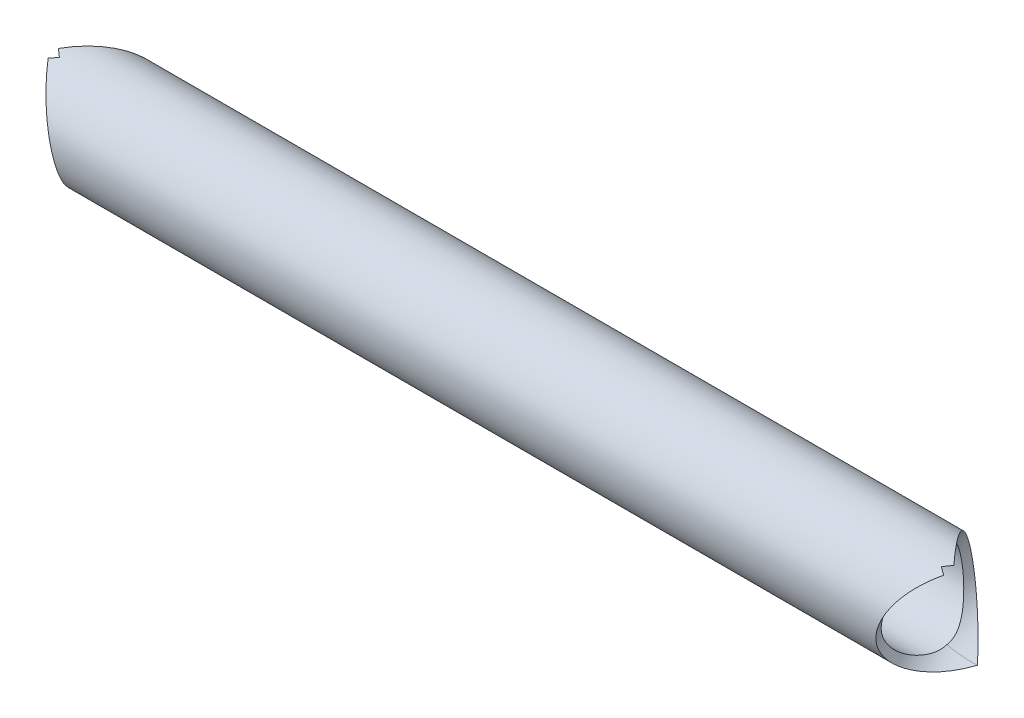
ISO-10303-21;
HEADER;
FILE_DESCRIPTION(('STEP AP214'),'2;1');
FILE_NAME('part.step','',(''),(''),'','','');
FILE_SCHEMA(('AUTOMOTIVE_DESIGN { 1 0 10303 214 1 1 1 1 }'));
ENDSEC;
DATA;
#1=APPLICATION_CONTEXT('core data for automotive mechanical design processes');
#2=APPLICATION_PROTOCOL_DEFINITION('international standard','automotive_design',2000,#1);
#3=PRODUCT_CONTEXT('',#1,'mechanical');
#4=PRODUCT('Part','Part','',(#3));
#5=PRODUCT_RELATED_PRODUCT_CATEGORY('part','',(#4));
#6=PRODUCT_DEFINITION_FORMATION('','',#4);
#7=PRODUCT_DEFINITION_CONTEXT('part definition',#1,'design');
#8=PRODUCT_DEFINITION('design','',#6,#7);
#9=PRODUCT_DEFINITION_SHAPE('','',#8);
#10=(LENGTH_UNIT() NAMED_UNIT(*) SI_UNIT(.MILLI.,.METRE.));
#11=(NAMED_UNIT(*) PLANE_ANGLE_UNIT() SI_UNIT($,.RADIAN.));
#12=(NAMED_UNIT(*) SI_UNIT($,.STERADIAN.) SOLID_ANGLE_UNIT());
#13=UNCERTAINTY_MEASURE_WITH_UNIT(LENGTH_MEASURE(1.E-05),#10,'distance_accuracy_value','');
#14=(GEOMETRIC_REPRESENTATION_CONTEXT(3) GLOBAL_UNCERTAINTY_ASSIGNED_CONTEXT((#13)) GLOBAL_UNIT_ASSIGNED_CONTEXT((#10,
#11,#12)) REPRESENTATION_CONTEXT('',''));
#15=CARTESIAN_POINT('',(0.,0.,0.));
#16=DIRECTION('',(0.,0.,1.));
#17=DIRECTION('',(1.,0.,0.));
#18=AXIS2_PLACEMENT_3D('',#15,#16,#17);
#19=CARTESIAN_POINT('',(80.,380.,-601.037933611912));
#20=DIRECTION('',(-1.,0.,0.));
#21=DIRECTION('',(0.,0.,1.));
#22=AXIS2_PLACEMENT_3D('',#19,#20,#21);
#23=CYLINDRICAL_SURFACE('',#22,7.9);
#24=CARTESIAN_POINT('',(72.6234282023569,387.895685165085,-600.776867003838));
#25=CARTESIAN_POINT('',(72.7419163400177,387.890663168033,-600.626163456198));
#26=CARTESIAN_POINT('',(72.859015803931,387.881362750891,-600.474421668926));
#27=CARTESIAN_POINT('',(73.0890290954875,387.853489604008,-600.168119962919));
#28=CARTESIAN_POINT('',(73.2019330402644,387.834896308813,-600.013554529561));
#29=CARTESIAN_POINT('',(73.4236755131075,387.787293714173,-599.698589871312));
#30=CARTESIAN_POINT('',(73.5323973127416,387.758094705332,-599.538135600044));
#31=CARTESIAN_POINT('',(73.7409773176925,387.688390557703,-599.214165322958));
#32=CARTESIAN_POINT('',(73.8408428292287,387.647894854942,-599.050651978246));
#33=CARTESIAN_POINT('',(74.0722975078995,387.532770942898,-598.644171659117));
#34=CARTESIAN_POINT('',(74.1973449367732,387.451010831222,-598.399259070385));
#35=CARTESIAN_POINT('',(74.3579252710107,387.306170696069,-598.030075170644));
#36=CARTESIAN_POINT('',(74.4068438990541,387.25438406197,-597.907093170087));
#37=CARTESIAN_POINT('',(74.4947932069451,387.143151566321,-597.661011931836));
#38=CARTESIAN_POINT('',(74.5338245537636,387.083706221817,-597.537912702613));
#39=CARTESIAN_POINT('',(74.6014666113413,386.956538205448,-597.291469978048));
#40=CARTESIAN_POINT('',(74.629969438499,386.888738847828,-597.168136305291));
#41=CARTESIAN_POINT('',(74.6756650711443,386.745632056292,-596.923751331248));
#42=CARTESIAN_POINT('',(74.6928579904145,386.670324697918,-596.802700007012));
#43=CARTESIAN_POINT('',(74.7162468834617,386.512542506947,-596.563861137748));
#44=CARTESIAN_POINT('',(74.7224165670391,386.430051029989,-596.446082053158));
#45=CARTESIAN_POINT('',(74.7245300916079,386.258713235712,-596.215154991342));
#46=CARTESIAN_POINT('',(74.7204722756937,386.169865890977,-596.102007767518));
#47=CARTESIAN_POINT('',(74.7016878502552,385.968745277852,-595.859765922399));
#48=CARTESIAN_POINT('',(74.6850484765049,385.855266082782,-595.731822842886));
#49=CARTESIAN_POINT('',(74.6412868709057,385.621247378115,-595.484503009629));
#50=CARTESIAN_POINT('',(74.6141620503668,385.500706131249,-595.365128379935));
#51=CARTESIAN_POINT('',(74.5516788128076,385.253147287763,-595.135133599991));
#52=CARTESIAN_POINT('',(74.5163043567591,385.126117456593,-595.024531073217));
#53=CARTESIAN_POINT('',(74.4394108556148,384.866390351271,-594.812472325989));
#54=CARTESIAN_POINT('',(74.3978899719672,384.733691389818,-594.711018856912));
#55=CARTESIAN_POINT('',(74.293981134606,384.411998098942,-594.480737468342));
#56=CARTESIAN_POINT('',(74.2296344393609,384.220669365364,-594.356040921577));
#57=CARTESIAN_POINT('',(74.0964649200832,383.829114631312,-594.124202829122));
#58=CARTESIAN_POINT('',(74.0276406849315,383.628885832298,-594.017066855539));
#59=CARTESIAN_POINT('',(73.8885216224553,383.220361195198,-593.820548538975));
#60=CARTESIAN_POINT('',(73.8182266418514,383.012064514341,-593.73116805674));
#61=CARTESIAN_POINT('',(73.6786479158794,382.588293215173,-593.570532750556));
#62=CARTESIAN_POINT('',(73.6093640613114,382.372819380356,-593.499275955418));
#63=CARTESIAN_POINT('',(73.4732501369001,381.933571001087,-593.374781958532));
#64=CARTESIAN_POINT('',(73.4064492265927,381.709737500883,-593.321720293088));
#65=CARTESIAN_POINT('',(73.2778705506929,381.256876404631,-593.235152055572));
#66=CARTESIAN_POINT('',(73.2160929591126,381.027848629,-593.201646160681));
#67=CARTESIAN_POINT('',(73.0992715707099,380.566189235456,-593.1548367455));
#68=CARTESIAN_POINT('',(73.0442231439399,380.333560220925,-593.141519261985));
#69=CARTESIAN_POINT('',(72.9422947322015,379.866249867501,-593.13561143224));
#70=CARTESIAN_POINT('',(72.8954139922296,379.631568720411,-593.143019169134));
#71=CARTESIAN_POINT('',(72.8136060508066,379.176057918041,-593.17789833));
#72=CARTESIAN_POINT('',(72.7781344425701,378.955233037887,-593.204152559518));
#73=CARTESIAN_POINT('',(72.7164367308295,378.515327058259,-593.275499297318));
#74=CARTESIAN_POINT('',(72.6902103528337,378.296245907202,-593.320591246219));
#75=CARTESIAN_POINT('',(72.6476913835826,377.861923197592,-593.429469786383));
#76=CARTESIAN_POINT('',(72.63139306193,377.646679493877,-593.493245561944));
#77=CARTESIAN_POINT('',(72.609138236241,377.221940662379,-593.639096612484));
#78=CARTESIAN_POINT('',(72.6031807115428,377.012444969263,-593.721170080535));
#79=CARTESIAN_POINT('',(72.6018388230888,376.624046106746,-593.892803323212));
#80=CARTESIAN_POINT('',(72.6053540863035,376.444328630087,-593.98052046033));
#81=CARTESIAN_POINT('',(72.6206000150695,376.092329064915,-594.169165605737));
#82=CARTESIAN_POINT('',(72.6323305395895,375.920046848815,-594.270093387215));
#83=CARTESIAN_POINT('',(72.663760865053,375.584142406648,-594.484317467498));
#84=CARTESIAN_POINT('',(72.683460123724,375.420519592165,-594.597612924299));
#85=CARTESIAN_POINT('',(72.7304231491658,375.102968168777,-594.835639230517));
#86=CARTESIAN_POINT('',(72.7576871063282,374.949039803985,-594.960370367697));
#87=CARTESIAN_POINT('',(72.8189066819102,374.653335652528,-595.218883551834));
#88=CARTESIAN_POINT('',(72.8527885777824,374.511448677326,-595.352556082536));
#89=CARTESIAN_POINT('',(72.9267881796682,374.238665442924,-595.629165491414));
#90=CARTESIAN_POINT('',(72.9669083000378,374.107773469414,-595.772105943978));
#91=CARTESIAN_POINT('',(73.0526063116039,373.857628134615,-596.066161879943));
#92=CARTESIAN_POINT('',(73.0981817279505,373.738369539959,-596.217273639419));
#93=CARTESIAN_POINT('',(73.1939701240942,373.511807964755,-596.526818493879));
#94=CARTESIAN_POINT('',(73.2441835504644,373.40450613767,-596.685252293133));
#95=CARTESIAN_POINT('',(73.3530608814087,373.192949457621,-597.023291330216));
#96=CARTESIAN_POINT('',(73.4120780121053,373.089858798044,-597.20351173733));
#97=CARTESIAN_POINT('',(73.5332081214725,372.898526558271,-597.57066697778));
#98=CARTESIAN_POINT('',(73.595321300694,372.810285941633,-597.75760224586));
#99=CARTESIAN_POINT('',(73.7213186849631,372.648658095351,-598.1378368551));
#100=CARTESIAN_POINT('',(73.7852070960394,372.575310305851,-598.331151558291));
#101=CARTESIAN_POINT('',(73.9128750171396,372.443968823159,-598.722962765673));
#102=CARTESIAN_POINT('',(73.9766545244569,372.3859755062,-598.921459396705));
#103=CARTESIAN_POINT('',(74.1094074361378,372.279736903406,-599.346493784155));
#104=CARTESIAN_POINT('',(74.1781179740904,372.233419949592,-599.573599903699));
#105=CARTESIAN_POINT('',(74.3094363213188,372.160744644094,-600.032874422864));
#106=CARTESIAN_POINT('',(74.3720413857429,372.134395233552,-600.265045042471));
#107=CARTESIAN_POINT('',(74.4864632044057,372.102442961275,-600.732522281805));
#108=CARTESIAN_POINT('',(74.5383218773911,372.096757999623,-600.96781275567));
#109=CARTESIAN_POINT('',(74.6259918796427,372.106747387246,-601.440858164109));
#110=CARTESIAN_POINT('',(74.661822596772,372.122395837731,-601.678609763332));
#111=CARTESIAN_POINT('',(74.70019587981,372.163815141246,-602.048903958512));
#112=CARTESIAN_POINT('',(74.710451402861,372.182060263421,-602.181524985683));
#113=CARTESIAN_POINT('',(74.7228806600127,372.225346591261,-602.44601600691));
#114=CARTESIAN_POINT('',(74.7250576225821,372.250385077773,-602.577886279951));
#115=CARTESIAN_POINT('',(74.7203892109923,372.307060693616,-602.839764745211));
#116=CARTESIAN_POINT('',(74.7135627877457,372.338683845259,-602.969776268227));
#117=CARTESIAN_POINT('',(74.6902804736822,372.408244847042,-603.227233477078));
#118=CARTESIAN_POINT('',(74.6738245426521,372.446182723552,-603.354679152197));
#119=CARTESIAN_POINT('',(74.6310215961045,372.527965949178,-603.60624609943));
#120=CARTESIAN_POINT('',(74.6046557435869,372.571822446134,-603.730360555037));
#121=CARTESIAN_POINT('',(74.5423292104463,372.664748494029,-603.97410883956));
#122=CARTESIAN_POINT('',(74.5063684295868,372.713818099426,-604.093742621653));
#123=CARTESIAN_POINT('',(74.3848447632745,372.868070071681,-604.445434948074));
#124=CARTESIAN_POINT('',(74.2857070179757,372.98017061009,-604.669907498576));
#125=CARTESIAN_POINT('',(74.0889805836631,373.186983208153,-605.041153689865));
#126=CARTESIAN_POINT('',(73.9975705856363,373.278736476447,-605.193047710731));
#127=CARTESIAN_POINT('',(73.8029849788996,373.468363750153,-605.485182417571));
#128=CARTESIAN_POINT('',(73.6998014795882,373.566241840345,-605.625415178052));
#129=CARTESIAN_POINT('',(73.4846169513265,373.767318750616,-605.895096707995));
#130=CARTESIAN_POINT('',(73.3726058254974,373.870523615424,-606.024532769763));
#131=CARTESIAN_POINT('',(73.1423212196523,374.081686564981,-606.273406674654));
#132=CARTESIAN_POINT('',(73.0240503863733,374.189642637618,-606.3928486892));
#133=CARTESIAN_POINT('',(72.8574187457183,374.342136191985,-606.551761184155));
#134=CARTESIAN_POINT('',(72.8109286826508,374.384722857113,-606.595120841214));
#135=CARTESIAN_POINT('',(72.7175141709013,374.470451903397,-606.6804280929));
#136=CARTESIAN_POINT('',(72.6705912754161,374.513592426197,-606.722379254777));
#137=CARTESIAN_POINT('',(72.623428202357,374.557069400984,-606.76370923573));
#138=B_SPLINE_CURVE_WITH_KNOTS('',3,(#24,#25,#26,#27,#28,#29,#30,#31,#32,#33,#34,#35,#36,#37,
#38,#39,#40,#41,#42,#43,#44,#45,#46,#47,#48,#49,#50,#51,#52,#53,#54,#55,#56,#57,#58,#59,#60,#61,
#62,#63,#64,#65,#66,#67,#68,#69,#70,#71,#72,#73,#74,#75,#76,#77,#78,#79,#80,#81,#82,#83,#84,#85,
#86,#87,#88,#89,#90,#91,#92,#93,#94,#95,#96,#97,#98,#99,#100,#101,#102,#103,#104,#105,#106,#107,
#108,#109,#110,#111,#112,#113,#114,#115,#116,#117,#118,#119,#120,#121,#122,#123,#124,#125,#126,
#127,#128,#129,#130,#131,#132,#133,#134,#135,#136,#137),.UNSPECIFIED.,.F.,.F.,(4,2,2,2,2,2,2,2,
2,2,2,2,2,2,2,2,2,2,2,2,2,2,2,2,2,2,2,2,2,2,2,2,2,2,2,2,2,2,2,2,2,2,2,2,2,2,2,2,2,2,2,2,2,2,2,2,
4),(0.,0.575358578963902,1.15199612174352,1.73950175878338,2.32651811959755,3.18359203742226,
3.60951153846728,4.03540230041598,4.46554338052667,4.89568013316811,5.32684139096278,
5.75807250351092,6.27276041178479,6.7875754695496,7.30339990573704,7.81937895099745,
8.53021841100843,9.24128299112997,9.95242205035535,10.663483730777,11.3812240971539,
12.0989893160935,12.8162578690621,13.5334600840477,14.2080853395902,14.8826905637682,
15.5569060411711,16.2310549680882,16.830362080798,17.4296589054717,18.0289149548439,
18.6281860879065,19.2211274086114,19.8142987869637,20.4072020798358,21.0001625203222,
21.647039069031,22.2939575746725,22.9425675664181,23.5911934496442,24.3155399392198,
25.0402105880474,25.7619989518423,26.4829118435512,26.8853472271877,27.2876217665785,
27.6890509221798,28.0904817541755,28.4926795258053,28.8948814992955,29.7004774495886,
30.2985653976226,30.8970565650784,31.4962424977515,32.0951770749804,32.3247201178957,
32.5536295722896),.UNSPECIFIED.);
#139=CARTESIAN_POINT('',(74.3478278193209,387.313504334373,-598.050852369108));
#140=VERTEX_POINT('',#139);
#141=CARTESIAN_POINT('',(74.7086440246403,372.351897591818,-603.016955985197));
#142=VERTEX_POINT('',#141);
#143=EDGE_CURVE('E124',#140,#142,#138,.T.);
#144=ORIENTED_EDGE('',*,*,#143,.T.);
#145=CARTESIAN_POINT('',(72.2201430082169,372.819949041804,-597.742957399902));
#146=CARTESIAN_POINT('',(72.2899920072688,372.774416654397,-597.84218635495));
#147=CARTESIAN_POINT('',(72.3599930944849,372.730980068178,-597.942254085475));
#148=CARTESIAN_POINT('',(72.4999975638562,372.648286648241,-598.144109131026));
#149=CARTESIAN_POINT('',(72.5700009459337,372.609030038328,-598.24589653779));
#150=CARTESIAN_POINT('',(72.7798526198625,372.497358544934,-598.55432945814));
#151=CARTESIAN_POINT('',(72.9192375593868,372.431238970099,-598.763616648373));
#152=CARTESIAN_POINT('',(73.1964431309453,372.314940043622,-599.193881269837));
#153=CARTESIAN_POINT('',(73.3341760885695,372.265107593013,-599.41500908369));
#154=CARTESIAN_POINT('',(73.6009168087595,372.184117546914,-599.865611946163));
#155=CARTESIAN_POINT('',(73.7299339262723,372.152939637133,-600.095077625059));
#156=CARTESIAN_POINT('',(73.9213513957267,372.119831497982,-600.462718215158));
#157=CARTESIAN_POINT('',(73.9885647416492,372.111090837634,-600.597775105574));
#158=CARTESIAN_POINT('',(74.1170222440147,372.100579799621,-600.870921686005));
#159=CARTESIAN_POINT('',(74.1782664597262,372.098809352742,-601.009011345891));
#160=CARTESIAN_POINT('',(74.3501688072312,372.104687653261,-601.426419780329));
#161=CARTESIAN_POINT('',(74.4499131584121,372.123362032076,-601.71056657366));
#162=CARTESIAN_POINT('',(74.561754582477,372.173602021187,-602.120903850971));
#163=CARTESIAN_POINT('',(74.591306919254,372.1916269433,-602.244198723456));
#164=CARTESIAN_POINT('',(74.6418760997689,372.233857827069,-602.491457099972));
#165=CARTESIAN_POINT('',(74.6628972845416,372.258060634899,-602.615420231342));
#166=CARTESIAN_POINT('',(74.6958328264682,372.312699175838,-602.863173426018));
#167=CARTESIAN_POINT('',(74.7077479755009,372.343134366675,-602.986963503438));
#168=CARTESIAN_POINT('',(74.7222981708386,372.410131385109,-603.233429599702));
#169=CARTESIAN_POINT('',(74.7249329549252,372.446693385791,-603.356105586968));
#170=CARTESIAN_POINT('',(74.7211675106256,372.525575652974,-603.599034362108));
#171=CARTESIAN_POINT('',(74.7147945786732,372.567878173031,-603.719293355666));
#172=CARTESIAN_POINT('',(74.6936822402525,372.657982336443,-603.957002631923));
#173=CARTESIAN_POINT('',(74.6789393135527,372.705786286827,-604.074451711161));
#174=CARTESIAN_POINT('',(74.6233743141557,372.857010055386,-604.421931768065));
#175=CARTESIAN_POINT('',(74.5712222305215,372.968169319345,-604.646874003364));
#176=CARTESIAN_POINT('',(74.4577720311786,373.18357416223,-605.036110860955));
#177=CARTESIAN_POINT('',(74.4004837985723,373.284637284121,-605.203443148976));
#178=CARTESIAN_POINT('',(74.2757001906061,373.496929250116,-605.5276546711));
#179=CARTESIAN_POINT('',(74.2081986917432,373.608164176928,-605.68452755228));
#180=CARTESIAN_POINT('',(74.0660515746413,373.840218283454,-605.988052513214));
#181=CARTESIAN_POINT('',(73.9913923505609,373.961055638371,-606.134684173737));
#182=CARTESIAN_POINT('',(73.8376267194237,374.211627765769,-606.417565161631));
#183=CARTESIAN_POINT('',(73.7585210744019,374.34136101449,-606.55381625867));
#184=CARTESIAN_POINT('',(73.593419253104,374.616959431722,-606.823441321789));
#185=CARTESIAN_POINT('',(73.507285733176,374.763321500956,-606.956222763748));
#186=CARTESIAN_POINT('',(73.3343990492547,375.065355524425,-607.210309824171));
#187=CARTESIAN_POINT('',(73.2476458494367,375.221028020808,-607.331614773292));
#188=CARTESIAN_POINT('',(73.0753436381637,375.541263942094,-607.562393901962));
#189=CARTESIAN_POINT('',(72.9897935057563,375.70581828898,-607.671879830531));
#190=CARTESIAN_POINT('',(72.821331407954,376.04371575434,-607.87877167724));
#191=CARTESIAN_POINT('',(72.7384200682553,376.217060932348,-607.97617474599));
#192=CARTESIAN_POINT('',(72.5746163725594,376.576682370499,-608.160627375332));
#193=CARTESIAN_POINT('',(72.4938298530854,376.763175942067,-608.24734850822));
#194=CARTESIAN_POINT('',(72.3380231751114,377.144452711416,-608.406687715025));
#195=CARTESIAN_POINT('',(72.2630033552229,377.339236394938,-608.479304961166));
#196=CARTESIAN_POINT('',(72.120132531064,377.736406934343,-608.609580326331));
#197=CARTESIAN_POINT('',(72.0522841121633,377.938796496826,-608.667233061314));
#198=CARTESIAN_POINT('',(71.9251958374996,378.350005809732,-608.766596647736));
#199=CARTESIAN_POINT('',(71.8659519319337,378.558822478718,-608.808315014017));
#200=CARTESIAN_POINT('',(71.7568646275584,378.983516387963,-608.875239581011));
#201=CARTESIAN_POINT('',(71.7071077150663,379.199439321296,-608.900298608427));
#202=CARTESIAN_POINT('',(71.6188536177008,379.634925084399,-608.932512915008));
#203=CARTESIAN_POINT('',(71.5803566557726,379.854487986149,-608.939667839695));
#204=CARTESIAN_POINT('',(71.5156681063235,380.295046717244,-608.935491755125));
#205=CARTESIAN_POINT('',(71.4894646146295,380.516040949429,-608.924178676807));
#206=CARTESIAN_POINT('',(71.4500448706156,380.957425898618,-608.882832671196));
#207=CARTESIAN_POINT('',(71.4368263830589,381.177816712979,-608.852802967236));
#208=CARTESIAN_POINT('',(71.4247010175965,381.583702190177,-608.779897372528));
#209=CARTESIAN_POINT('',(71.4239886531444,381.769600150985,-608.739532501851));
#210=CARTESIAN_POINT('',(71.4323191223026,382.137793335057,-608.645556653415));
#211=CARTESIAN_POINT('',(71.4413615187525,382.320088719399,-608.591946269339));
#212=CARTESIAN_POINT('',(71.4690086592471,382.679667158743,-608.471997587637));
#213=CARTESIAN_POINT('',(71.4876123998672,382.856950737655,-608.405660626071));
#214=CARTESIAN_POINT('',(71.5339970963863,383.205282945876,-608.260933884847));
#215=CARTESIAN_POINT('',(71.5617782294812,383.37633145473,-608.182543872485));
#216=CARTESIAN_POINT('',(71.6248135392658,383.705097324708,-608.01753699924));
#217=CARTESIAN_POINT('',(71.6597635173271,383.863072837377,-607.93131667561));
#218=CARTESIAN_POINT('',(71.7370872137122,384.171489913768,-607.749174813613));
#219=CARTESIAN_POINT('',(71.7794633202572,384.321929033735,-607.653250158569));
#220=CARTESIAN_POINT('',(71.8709281167156,384.614552279868,-607.452555735271));
#221=CARTESIAN_POINT('',(71.9200146441313,384.756739044491,-607.347788820665));
#222=CARTESIAN_POINT('',(72.0241838794042,385.03249845058,-607.130127801247));
#223=CARTESIAN_POINT('',(72.0792687488096,385.166067958955,-607.017230771682));
#224=CARTESIAN_POINT('',(72.2011173038541,385.438704401122,-606.770988217711));
#225=CARTESIAN_POINT('',(72.2684979083856,385.576707031478,-606.63676954087));
#226=CARTESIAN_POINT('',(72.40861398042,385.841352059232,-606.360083289307));
#227=CARTESIAN_POINT('',(72.4813517215898,385.967989581893,-606.21761221766));
#228=CARTESIAN_POINT('',(72.6310804534544,386.209779821318,-605.925128027279));
#229=CARTESIAN_POINT('',(72.7080749936288,386.324922721978,-605.775108624125));
#230=CARTESIAN_POINT('',(72.865077029407,386.54351472847,-605.468272853069));
#231=CARTESIAN_POINT('',(72.9450848661635,386.646962504892,-605.31145571525));
#232=CARTESIAN_POINT('',(73.1219157061544,386.860256052248,-604.961744363493));
#233=CARTESIAN_POINT('',(73.2190967846735,386.967709020999,-604.767567800647));
#234=CARTESIAN_POINT('',(73.4136306915406,387.1659322125,-604.370889988395));
#235=CARTESIAN_POINT('',(73.5109835601635,387.256697783593,-604.168386437008));
#236=CARTESIAN_POINT('',(73.7030904588344,387.421216627172,-603.755457235852));
#237=CARTESIAN_POINT('',(73.7978451845648,387.494974493643,-603.545033743261));
#238=CARTESIAN_POINT('',(73.9814146773563,387.624973992232,-603.116371378712));
#239=CARTESIAN_POINT('',(74.0702322886065,387.681224059414,-602.898136326964));
#240=CARTESIAN_POINT('',(74.2078006931274,387.758599150564,-602.533086993977));
#241=CARTESIAN_POINT('',(74.2595521410933,387.785098344881,-602.388529583471));
#242=CARTESIAN_POINT('',(74.3574131545171,387.830189594155,-602.096234188889));
#243=CARTESIAN_POINT('',(74.4035214656304,387.848779893405,-601.948495506239));
#244=CARTESIAN_POINT('',(74.4883721296248,387.877643438907,-601.650398067596));
#245=CARTESIAN_POINT('',(74.527128333382,387.887932445685,-601.500044832818));
#246=CARTESIAN_POINT('',(74.595564301485,387.899851961931,-601.197001535349));
#247=CARTESIAN_POINT('',(74.6252500300493,387.901488172568,-601.044313077832));
#248=CARTESIAN_POINT('',(74.6696014348892,387.896261781431,-600.763628402386));
#249=CARTESIAN_POINT('',(74.6859676675922,387.890804906012,-600.635875524432));
#250=CARTESIAN_POINT('',(74.7102988701369,387.873600796501,-600.380032805281));
#251=CARTESIAN_POINT('',(74.7182678484527,387.861856567752,-600.251943154146));
#252=CARTESIAN_POINT('',(74.725125567426,387.832091730096,-599.996360981031));
#253=CARTESIAN_POINT('',(74.7240227870926,387.814076997062,-599.868868012873));
#254=CARTESIAN_POINT('',(74.7124405490539,387.771917734198,-599.615326346326));
#255=CARTESIAN_POINT('',(74.7019609758092,387.747773128839,-599.489277665752));
#256=CARTESIAN_POINT('',(74.6717593356895,387.693687328842,-599.239755385574));
#257=CARTESIAN_POINT('',(74.6520510194027,387.663754796885,-599.116278239376));
#258=CARTESIAN_POINT('',(74.6039252444654,387.59846996243,-598.872475648838));
#259=CARTESIAN_POINT('',(74.5755041341168,387.563115390562,-598.752151548997));
#260=CARTESIAN_POINT('',(74.4782678710607,387.449487598457,-598.396527513935));
#261=CARTESIAN_POINT('',(74.3975092587245,387.363700057219,-598.166800718042));
#262=CARTESIAN_POINT('',(74.2309480835373,387.194480984713,-597.768904857802));
#263=CARTESIAN_POINT('',(74.1493688834162,387.11399625974,-597.597600538636));
#264=CARTESIAN_POINT('',(73.974980899521,386.943635230113,-597.265569765453));
#265=CARTESIAN_POINT('',(73.8821643396458,386.853752428049,-597.104850756447));
#266=CARTESIAN_POINT('',(73.6882844729859,386.66516489215,-596.793065930043));
#267=CARTESIAN_POINT('',(73.5871949722453,386.566432035043,-596.642033705024));
#268=CARTESIAN_POINT('',(73.3796673335481,386.360914350924,-596.34957705861));
#269=CARTESIAN_POINT('',(73.2732308263465,386.254131973978,-596.208149738445));
#270=CARTESIAN_POINT('',(73.0106500236987,385.9852158166,-595.875515548488));
#271=CARTESIAN_POINT('',(72.8527620240191,385.818981870721,-595.688968357984));
#272=CARTESIAN_POINT('',(72.615119522746,385.558604728006,-595.423034031401));
#273=CARTESIAN_POINT('',(72.5361194077963,385.470386387893,-595.337051746909));
#274=CARTESIAN_POINT('',(72.3780635895932,385.290050352317,-595.169329699092));
#275=CARTESIAN_POINT('',(72.2990078858471,385.197932621863,-595.087589973852));
#276=CARTESIAN_POINT('',(72.2201430082169,385.103846004179,-595.007945555073));
#277=B_SPLINE_CURVE_WITH_KNOTS('',3,(#145,#146,#147,#148,#149,#150,#151,#152,#153,#154,#155,
#156,#157,#158,#159,#160,#161,#162,#163,#164,#165,#166,#167,#168,#169,#170,#171,#172,#173,#174,
#175,#176,#177,#178,#179,#180,#181,#182,#183,#184,#185,#186,#187,#188,#189,#190,#191,#192,#193,
#194,#195,#196,#197,#198,#199,#200,#201,#202,#203,#204,#205,#206,#207,#208,#209,#210,#211,#212,
#213,#214,#215,#216,#217,#218,#219,#220,#221,#222,#223,#224,#225,#226,#227,#228,#229,#230,#231,
#232,#233,#234,#235,#236,#237,#238,#239,#240,#241,#242,#243,#244,#245,#246,#247,#248,#249,#250,
#251,#252,#253,#254,#255,#256,#257,#258,#259,#260,#261,#262,#263,#264,#265,#266,#267,#268,#269,
#270,#271,#272,#273,#274,#275,#276),.UNSPECIFIED.,.F.,.F.,(4,2,2,2,2,2,2,2,2,2,2,2,2,2,2,2,2,2,
2,2,2,2,2,2,2,2,2,2,2,2,2,2,2,2,2,2,2,2,2,2,2,2,2,2,2,2,2,2,2,2,2,2,2,2,2,2,2,2,2,2,2,2,2,2,2,
4),(0.,0.388782784233608,0.777586374231792,1.55687579204753,2.3518201098578,3.14589717170717,
3.59893453732102,4.05196740420176,4.95229006742877,5.33613280465724,5.71977997976871,
6.10339378836949,6.48701843596092,6.86948306003757,7.25210865942886,8.01805173829065,
8.62840473609834,9.23912514019302,9.85103036836263,10.4628310450621,11.1090313432579,
11.7552693065602,12.4008588259323,13.04660030049,13.7088535508172,14.3711456579371,
15.0336757201262,15.6958929381175,16.363885266965,17.0318908210571,17.6992481813679,
18.3664906427301,18.9364588703672,19.5064015558931,20.0762844404339,20.6461783288411,
21.1956062996099,21.7452112901608,22.2946395809138,22.844266521678,23.4555532822492,
24.0671009960151,24.6791665663252,25.2913016416543,26.0173691702513,26.7436387862735,
27.469711997729,28.1954348517385,28.6625893921684,29.129847582856,29.5962165529638,
30.0622782026681,30.4486272330359,30.8347917539728,31.2205953834449,31.606403766792,
31.9916391258683,32.3770361656817,33.148518687323,33.7660308010294,34.3839726936661,
35.0039530226161,35.6237454015842,36.5093133158566,36.9482536100732,37.38719784402),.UNSPECIFIED.);
#278=EDGE_CURVE('E115',#142,#140,#277,.T.);
#279=ORIENTED_EDGE('',*,*,#278,.T.);
#280=EDGE_LOOP('',(#144,#279));
#281=FACE_BOUND('',#280,.T.);
#282=CARTESIAN_POINT('',(-72.2201430082168,385.103846004179,-595.007945555073));
#283=CARTESIAN_POINT('',(-72.2899920072688,385.187176926618,-595.07848307125));
#284=CARTESIAN_POINT('',(-72.3599930944849,385.268965889948,-595.150669310881));
#285=CARTESIAN_POINT('',(-72.4999975638562,385.42948846238,-595.298372272447));
#286=CARTESIAN_POINT('',(-72.5700009459336,385.50822190774,-595.373889172406));
#287=CARTESIAN_POINT('',(-72.7798526198624,385.740202776817,-595.605807833092));
#288=CARTESIAN_POINT('',(-72.9192375593868,385.888870346964,-595.767272627269));
#289=CARTESIAN_POINT('',(-73.1964431309453,386.176730827138,-596.107551084914));
#290=CARTESIAN_POINT('',(-73.3341760885696,386.315673408115,-596.286648104389));
#291=CARTESIAN_POINT('',(-73.6009168087596,386.58018926974,-596.660324015017));
#292=CARTESIAN_POINT('',(-73.7299339262724,386.70577697045,-596.854885802838));
#293=CARTESIAN_POINT('',(-73.9213513957267,386.891735767701,-597.173751100559));
#294=CARTESIAN_POINT('',(-73.9885647416492,386.95695108235,-597.292341679981));
#295=CARTESIAN_POINT('',(-74.1170222440147,387.082356585336,-597.53522641837));
#296=CARTESIAN_POINT('',(-74.1782664597261,387.142546823567,-597.659520520689));
#297=CARTESIAN_POINT('',(-74.3501688072312,387.314316878646,-598.03999312645));
#298=CARTESIAN_POINT('',(-74.449913158412,387.417960956504,-598.305221401167));
#299=CARTESIAN_POINT('',(-74.561754582477,387.546559811026,-598.698112063149));
#300=CARTESIAN_POINT('',(-74.5913069192539,387.582547661444,-598.81740748645));
#301=CARTESIAN_POINT('',(-74.6418760997688,387.649209883526,-599.059226221142));
#302=CARTESIAN_POINT('',(-74.6628972845415,387.679886952987,-599.181747857007));
#303=CARTESIAN_POINT('',(-74.6958328264681,387.735523522453,-599.429278840455));
#304=CARTESIAN_POINT('',(-74.7077479755008,387.760483519492,-599.554287970749));
#305=CARTESIAN_POINT('',(-74.7222981708385,387.80438296003,-599.805896746842));
#306=CARTESIAN_POINT('',(-74.7249329549252,387.823322233398,-599.93249643748));
#307=CARTESIAN_POINT('',(-74.7211675106256,387.854958373326,-600.185944571263));
#308=CARTESIAN_POINT('',(-74.7147945786731,387.867673942816,-600.31279110463));
#309=CARTESIAN_POINT('',(-74.6936822402525,387.886933777831,-600.566273883212));
#310=CARTESIAN_POINT('',(-74.6789393135527,387.893475443666,-600.692910017449));
#311=CARTESIAN_POINT('',(-74.6233743141557,387.903961474329,-601.071725356742));
#312=CARTESIAN_POINT('',(-74.5712222305216,387.898738496527,-601.322580118882));
#313=CARTESIAN_POINT('',(-74.4577720311786,387.868822290205,-601.766437751738));
#314=CARTESIAN_POINT('',(-74.4004837985723,387.848299677712,-601.960841125158));
#315=CARTESIAN_POINT('',(-74.2757001906061,387.793614121778,-602.344495240053));
#316=CARTESIAN_POINT('',(-74.2081986917432,387.75944297488,-602.533742809423));
#317=CARTESIAN_POINT('',(-74.0660515746414,387.678085429218,-602.907048930494));
#318=CARTESIAN_POINT('',(-73.991392350561,387.630873908914,-603.091096702993));
#319=CARTESIAN_POINT('',(-73.8376267194238,387.523989038249,-603.453565555122));
#320=CARTESIAN_POINT('',(-73.758521074402,387.464317818523,-603.631987590768));
#321=CARTESIAN_POINT('',(-73.593419253104,387.32914665985,-603.993070573067));
#322=CARTESIAN_POINT('',(-73.5072857331761,387.252945370027,-604.175405786529));
#323=CARTESIAN_POINT('',(-73.3343990492548,387.087243522908,-604.533634321782));
#324=CARTESIAN_POINT('',(-73.2476458494368,386.997742190696,-604.709527267473));
#325=CARTESIAN_POINT('',(-73.0753436381639,386.805669046959,-605.054372100646));
#326=CARTESIAN_POINT('',(-72.9897935057565,386.703110440642,-605.223330775783));
#327=CARTESIAN_POINT('',(-72.8213314079541,386.484909510601,-605.554038029196));
#328=CARTESIAN_POINT('',(-72.7384200682554,386.369264112987,-605.71578490104));
#329=CARTESIAN_POINT('',(-72.5746163725595,386.12187108617,-606.035389409037));
#330=CARTESIAN_POINT('',(-72.4938298530855,385.989787332123,-606.19304184017));
#331=CARTESIAN_POINT('',(-72.3380231751115,385.71212978614,-606.499092889554));
#332=CARTESIAN_POINT('',(-72.2630033552229,385.566555203149,-606.647490964307));
#333=CARTESIAN_POINT('',(-72.1201325310641,385.262174406012,-606.933966859408));
#334=CARTESIAN_POINT('',(-72.0522841121634,385.103363456662,-607.072040952633));
#335=CARTESIAN_POINT('',(-71.9251958374997,384.773155155003,-607.336481302888));
#336=CARTESIAN_POINT('',(-71.8659519319338,384.601763781355,-607.462853057527));
#337=CARTESIAN_POINT('',(-71.7568646275585,384.245581843438,-607.703639770863));
#338=CARTESIAN_POINT('',(-71.7071077150663,384.060687461487,-607.817940844861));
#339=CARTESIAN_POINT('',(-71.6188536177008,383.680006649254,-608.031874784692));
#340=CARTESIAN_POINT('',(-71.5803566557726,383.4842200034,-608.131507360073));
#341=CARTESIAN_POINT('',(-71.5156681063235,383.083506151705,-608.314640765782));
#342=CARTESIAN_POINT('',(-71.4894646146295,382.878587999678,-608.398157155608));
#343=CARTESIAN_POINT('',(-71.4500448706156,382.461355966504,-608.547982373928));
#344=CARTESIAN_POINT('',(-71.4368263830589,382.249043364755,-608.614294162573));
#345=CARTESIAN_POINT('',(-71.4247010175965,381.850567678103,-608.720479724148));
#346=CARTESIAN_POINT('',(-71.4239886531444,381.665104737754,-608.762798424204));
#347=CARTESIAN_POINT('',(-71.4323191223026,381.291821367591,-608.833912462529));
#348=CARTESIAN_POINT('',(-71.4413615187524,381.104001043797,-608.862708406738));
#349=CARTESIAN_POINT('',(-71.469008659247,380.727499196731,-608.906648131805));
#350=CARTESIAN_POINT('',(-71.4876123998671,380.538817765888,-608.921793344792));
#351=CARTESIAN_POINT('',(-71.5339970963862,380.161987253613,-608.938524212343));
#352=CARTESIAN_POINT('',(-71.5617782294811,379.973838182532,-608.940109605079));
#353=CARTESIAN_POINT('',(-71.6248135392657,379.60612149391,-608.930174697459));
#354=CARTESIAN_POINT('',(-71.659763517327,379.426488348784,-608.919123001572));
#355=CARTESIAN_POINT('',(-71.7370872137121,379.069928409665,-608.885038390423));
#356=CARTESIAN_POINT('',(-71.7794633202571,378.893002506276,-608.86200161609));
#357=CARTESIAN_POINT('',(-71.8709281167154,378.542873199708,-608.804416163041));
#358=CARTESIAN_POINT('',(-71.9200146441311,378.369668618022,-608.769871187821));
#359=CARTESIAN_POINT('',(-72.024183879404,378.027611751459,-608.689767071461));
#360=CARTESIAN_POINT('',(-72.0792687488094,377.858761062832,-608.64420395258));
#361=CARTESIAN_POINT('',(-72.2011173038539,377.50740592197,-608.536893235622));
#362=CARTESIAN_POINT('',(-72.2684979083854,377.325494784793,-608.473903416057));
#363=CARTESIAN_POINT('',(-72.4086139804198,376.968459873604,-608.33563431354));
#364=CARTESIAN_POINT('',(-72.4813517215896,376.793339030211,-608.260349795799));
#365=CARTESIAN_POINT('',(-72.6310804534541,376.450297406177,-608.098078523898));
#366=CARTESIAN_POINT('',(-72.7080749936286,376.282382848098,-608.011081914309));
#367=CARTESIAN_POINT('',(-72.8650770294068,375.95425915647,-607.825972490737));
#368=CARTESIAN_POINT('',(-72.9450848661633,375.794050900102,-607.727858415542));
#369=CARTESIAN_POINT('',(-73.1219157061542,375.452534417404,-607.501675615715));
#370=CARTESIAN_POINT('',(-73.2190967846733,375.272848901422,-607.371430487598));
#371=CARTESIAN_POINT('',(-73.4136306915404,374.925052808477,-607.096323966201));
#372=CARTESIAN_POINT('',(-73.5109835601633,374.756945467103,-606.951458514846));
#373=CARTESIAN_POINT('',(-73.7030904588342,374.432774950642,-606.647336086675));
#374=CARTESIAN_POINT('',(-73.7978451845646,374.276708530754,-606.488083012343));
#375=CARTESIAN_POINT('',(-73.9814146773561,373.977121467018,-606.15506817235));
#376=CARTESIAN_POINT('',(-74.0702322886062,373.833594805704,-605.981313444756));
#377=CARTESIAN_POINT('',(-74.2078006931272,373.608650049208,-605.68357567965));
#378=CARTESIAN_POINT('',(-74.2595521410931,373.523322964068,-605.563916410167));
#379=CARTESIAN_POINT('',(-74.3574131545169,373.35847958237,-605.318362998534));
#380=CARTESIAN_POINT('',(-74.4035214656303,373.278964579285,-605.192467478908));
#381=CARTESIAN_POINT('',(-74.4883721296247,373.126354355863,-604.934775207213));
#382=CARTESIAN_POINT('',(-74.5271283333819,373.053247206267,-604.802990141494));
#383=CARTESIAN_POINT('',(-74.5955643014849,372.913882052151,-604.533630402805));
#384=CARTESIAN_POINT('',(-74.6252500300491,372.847619566036,-604.396059602203));
#385=CARTESIAN_POINT('',(-74.6696014348891,372.733266708703,-604.139671953876));
#386=CARTESIAN_POINT('',(-74.6859676675921,372.684006642148,-604.021671864224));
#387=CARTESIAN_POINT('',(-74.7102988701368,372.591039696539,-603.782697754015));
#388=CARTESIAN_POINT('',(-74.7182678484527,372.547330176675,-603.661725180635));
#389=CARTESIAN_POINT('',(-74.725125567426,372.465847971969,-603.417657888497));
#390=CARTESIAN_POINT('',(-74.7240227870926,372.428069777013,-603.294565258654));
#391=CARTESIAN_POINT('',(-74.7124405490539,372.358676900232,-603.047087161093));
#392=CARTESIAN_POINT('',(-74.7019609758092,372.32706229436,-602.922701677462));
#393=CARTESIAN_POINT('',(-74.6717593356895,372.270174631226,-602.67380323261));
#394=CARTESIAN_POINT('',(-74.6520510194028,372.244892224881,-602.549290735117));
#395=CARTESIAN_POINT('',(-74.6039252444655,372.200572379457,-602.300820286041));
#396=CARTESIAN_POINT('',(-74.575504134117,372.181537565802,-602.176862589129));
#397=CARTESIAN_POINT('',(-74.4782678710609,372.133551771098,-601.806623351663));
#398=CARTESIAN_POINT('',(-74.3975092587246,372.113769788102,-601.562200406481));
#399=CARTESIAN_POINT('',(-74.2309480835375,372.098189348818,-601.13009687721));
#400=CARTESIAN_POINT('',(-74.1493688834164,372.098392262949,-600.940827440838));
#401=CARTESIAN_POINT('',(-73.9749808995212,372.111790361155,-600.56788266514));
#402=CARTESIAN_POINT('',(-73.8821643396462,372.124994587551,-600.384211310901));
#403=CARTESIAN_POINT('',(-73.6882844729863,372.163487163772,-600.021867057121));
#404=CARTESIAN_POINT('',(-73.5871949722458,372.188815232424,-599.843212644902));
#405=CARTESIAN_POINT('',(-73.3796673335486,372.250839007804,-599.491187844916));
#406=CARTESIAN_POINT('',(-73.2732308263471,372.287531266052,-599.317815871691));
#407=CARTESIAN_POINT('',(-73.0106500236992,372.389918632861,-598.902510885994));
#408=CARTESIAN_POINT('',(-72.8527620240195,372.461303544603,-598.663057814551));
#409=CARTESIAN_POINT('',(-72.6151195227463,372.584257143191,-598.311774830196));
#410=CARTESIAN_POINT('',(-72.5361194077966,372.627662544299,-598.196486496296));
#411=CARTESIAN_POINT('',(-72.3780635895933,372.719804321925,-597.968097214876));
#412=CARTESIAN_POINT('',(-72.2990078858472,372.768540746288,-597.854996286999));
#413=CARTESIAN_POINT('',(-72.2201430082169,372.819949041804,-597.742957399902));
#414=B_SPLINE_CURVE_WITH_KNOTS('',3,(#282,#283,#284,#285,#286,#287,#288,#289,#290,#291,#292,
#293,#294,#295,#296,#297,#298,#299,#300,#301,#302,#303,#304,#305,#306,#307,#308,#309,#310,#311,
#312,#313,#314,#315,#316,#317,#318,#319,#320,#321,#322,#323,#324,#325,#326,#327,#328,#329,#330,
#331,#332,#333,#334,#335,#336,#337,#338,#339,#340,#341,#342,#343,#344,#345,#346,#347,#348,#349,
#350,#351,#352,#353,#354,#355,#356,#357,#358,#359,#360,#361,#362,#363,#364,#365,#366,#367,#368,
#369,#370,#371,#372,#373,#374,#375,#376,#377,#378,#379,#380,#381,#382,#383,#384,#385,#386,#387,
#388,#389,#390,#391,#392,#393,#394,#395,#396,#397,#398,#399,#400,#401,#402,#403,#404,#405,#406,
#407,#408,#409,#410,#411,#412,#413),.UNSPECIFIED.,.F.,.F.,(4,2,2,2,2,2,2,2,2,2,2,2,2,2,2,2,2,2,
2,2,2,2,2,2,2,2,2,2,2,2,2,2,2,2,2,2,2,2,2,2,2,2,2,2,2,2,2,2,2,2,2,2,2,2,2,2,2,2,2,2,2,2,2,2,2,
4),(0.,0.388782784233672,0.777586374231894,1.55687579204771,2.351820109858,3.14589717170721,
3.59893453732107,4.05196740420176,4.95229006742883,5.3361328046571,5.71977997976837,
6.10339378836931,6.48701843596076,6.86948306003753,7.25210865942866,8.01805173829053,
8.62840473609821,9.2391251401929,9.85103036836257,10.4628310450618,11.1090313432576,
11.7552693065598,12.4008588259319,13.0466003004896,13.7088535508169,14.3711456579368,
15.0336757201257,15.695892938117,16.3638852669644,17.0318908210566,17.6992481813674,
18.3664906427296,18.9364588703666,19.5064015558926,20.0762844404334,20.6461783288407,
21.1956062996095,21.7452112901602,22.2946395809133,22.8442665216775,23.4555532822487,
24.0671009960146,24.6791665663246,25.2913016416538,26.017369170251,26.7436387862732,
27.4697119977286,28.195434851738,28.6625893921679,29.1298475828554,29.5962165529632,
30.0622782026677,30.4486272330355,30.8347917539725,31.2205953834444,31.6064037667916,
31.9916391258677,32.3770361656811,33.1485186873226,33.7660308010288,34.3839726936652,
35.0039530226152,35.6237454015831,36.5093133158559,36.9482536100728,37.38719784402),.UNSPECIFIED.);
#415=CARTESIAN_POINT('',(-74.347827819321,387.313504334373,-598.050852369108));
#416=VERTEX_POINT('',#415);
#417=CARTESIAN_POINT('',(-74.7086440246402,372.351897591818,-603.016955985197));
#418=VERTEX_POINT('',#417);
#419=EDGE_CURVE('E58',#416,#418,#414,.T.);
#420=ORIENTED_EDGE('',*,*,#419,.T.);
#421=CARTESIAN_POINT('',(-72.6234282023571,374.557069400984,-606.763709235729));
#422=CARTESIAN_POINT('',(-72.7419163400179,374.447808497825,-606.659791793659));
#423=CARTESIAN_POINT('',(-72.8590158039312,374.340615525054,-606.551987645539));
#424=CARTESIAN_POINT('',(-73.0890290954877,374.130286851111,-606.327578429289));
#425=CARTESIAN_POINT('',(-73.2019330402646,374.027160698515,-606.210954330297));
#426=CARTESIAN_POINT('',(-73.4236755131077,373.823472657644,-605.966046337431));
#427=CARTESIAN_POINT('',(-73.5323973127418,373.722995731751,-605.83758411478));
#428=CARTESIAN_POINT('',(-73.7409773176928,373.527268920877,-605.570177263453));
#429=CARTESIAN_POINT('',(-73.8408428292289,373.432014752491,-605.431241453648));
#430=CARTESIAN_POINT('',(-74.0722975078998,373.204828506748,-605.075058670924));
#431=CARTESIAN_POINT('',(-74.1973449367735,373.076182980386,-604.851189913551));
#432=CARTESIAN_POINT('',(-74.357925271011,372.896613820323,-604.497593627749));
#433=CARTESIAN_POINT('',(-74.4068438990544,372.839147339757,-604.377160943051));
#434=CARTESIAN_POINT('',(-74.4947932069454,372.729217496206,-604.130495028494));
#435=CARTESIAN_POINT('',(-74.5338245537639,372.676753795895,-604.004262190578));
#436=CARTESIAN_POINT('',(-74.6014666113416,372.577145423239,-603.745449723771));
#437=CARTESIAN_POINT('',(-74.6299694384993,372.530059059127,-603.612819327389));
#438=CARTESIAN_POINT('',(-74.6756650711446,372.442581863221,-603.343465824501));
#439=CARTESIAN_POINT('',(-74.6928579904148,372.402190964071,-603.206742759182));
#440=CARTESIAN_POINT('',(-74.716246883462,372.328611579483,-602.930110694116));
#441=CARTESIAN_POINT('',(-74.7224165670394,372.295440477984,-602.790194881704));
#442=CARTESIAN_POINT('',(-74.7245300916082,372.236782175813,-602.508693280975));
#443=CARTESIAN_POINT('',(-74.720472275694,372.211296220922,-602.367107225769));
#444=CARTESIAN_POINT('',(-74.7016878502555,372.163979206623,-602.055832889037));
#445=CARTESIAN_POINT('',(-74.6850484765052,372.143810046566,-601.886008967601));
#446=CARTESIAN_POINT('',(-74.641286870906,372.114564735934,-601.546779597024));
#447=CARTESIAN_POINT('',(-74.6141620503671,372.105491327028,-601.377374261626));
#448=CARTESIAN_POINT('',(-74.5516788128079,372.098189965827,-601.039543431306));
#449=CARTESIAN_POINT('',(-74.5163043567594,372.09998331269,-600.871120508748));
#450=CARTESIAN_POINT('',(-74.439410855615,372.114170577545,-600.536119310197));
#451=CARTESIAN_POINT('',(-74.3978899719674,372.126567672706,-600.369541602235));
#452=CARTESIAN_POINT('',(-74.2939811346062,372.168325691803,-599.97613041892));
#453=CARTESIAN_POINT('',(-74.2296344393612,372.202324951556,-599.750298704132));
#454=CARTESIAN_POINT('',(-74.0964649200835,372.289353338288,-599.303655590702));
#455=CARTESIAN_POINT('',(-74.0276406849318,372.342388488543,-599.082845804625));
#456=CARTESIAN_POINT('',(-73.8885216224555,372.467085251552,-598.646998876039));
#457=CARTESIAN_POINT('',(-73.8182266418517,372.538748814718,-598.431962340596));
#458=CARTESIAN_POINT('',(-73.6786479158796,372.700389423448,-598.008573477728));
#459=CARTESIAN_POINT('',(-73.6093640613116,372.79036447548,-597.800220425541));
#460=CARTESIAN_POINT('',(-73.4732501369003,372.98929506657,-597.389289149194));
#461=CARTESIAN_POINT('',(-73.4064492265929,373.098420943288,-597.186783546348));
#462=CARTESIAN_POINT('',(-73.2778705506931,373.3347356255,-596.790888859321));
#463=CARTESIAN_POINT('',(-73.2160929591127,373.461925056312,-596.597500091052));
#464=CARTESIAN_POINT('',(-73.09927157071,373.733793502219,-596.221457453687));
#465=CARTESIAN_POINT('',(-73.04422314394,373.878460354294,-596.038796249049));
#466=CARTESIAN_POINT('',(-72.9422947322016,374.184644503678,-595.685716745912));
#467=CARTESIAN_POINT('',(-72.8954139922297,374.346160241305,-595.515297316667));
#468=CARTESIAN_POINT('',(-72.8136060508066,374.6749759778,-595.198143003481));
#469=CARTESIAN_POINT('',(-72.7781344425701,374.841363371017,-595.050602678008));
#470=CARTESIAN_POINT('',(-72.7164367308295,375.187054249925,-594.769345777387));
#471=CARTESIAN_POINT('',(-72.6902103528337,375.366357351956,-594.635628791905));
#472=CARTESIAN_POINT('',(-72.6476913835826,375.736379346917,-594.383488997672));
#473=CARTESIAN_POINT('',(-72.63139306193,375.927091584634,-594.265057397487));
#474=CARTESIAN_POINT('',(-72.609138236241,376.318367810889,-594.044652046613));
#475=CARTESIAN_POINT('',(-72.6031807115427,376.518930825121,-593.942676672556));
#476=CARTESIAN_POINT('',(-72.6018388230887,376.905316932523,-593.766559034589));
#477=CARTESIAN_POINT('',(-72.6053540863034,377.090304521459,-593.690583647122));
#478=CARTESIAN_POINT('',(-72.6206000150694,377.465208319435,-593.552968869464));
#479=CARTESIAN_POINT('',(-72.6323305395894,377.655124443813,-593.491329233194));
#480=CARTESIAN_POINT('',(-72.663760865053,378.038442011877,-593.382741053111));
#481=CARTESIAN_POINT('',(-72.6834601237239,378.231843217548,-593.335791510022));
#482=CARTESIAN_POINT('',(-72.7304231491658,378.620746368009,-593.25673603261));
#483=CARTESIAN_POINT('',(-72.7576871063281,378.816248365553,-593.22463047194));
#484=CARTESIAN_POINT('',(-72.8189066819101,379.205937564242,-593.175514894091));
#485=CARTESIAN_POINT('',(-72.8527885777823,379.400116841416,-593.158349011871));
#486=CARTESIAN_POINT('',(-72.926788179668,379.788092302832,-593.138386562381));
#487=CARTESIAN_POINT('',(-72.9669083000376,379.981888309205,-593.135595572902));
#488=CARTESIAN_POINT('',(-73.0526063116037,380.367852716847,-593.144142972037));
#489=CARTESIAN_POINT('',(-73.0981817279503,380.560021814131,-593.155474975407));
#490=CARTESIAN_POINT('',(-73.193970124094,380.94188386604,-593.191937800209));
#491=CARTESIAN_POINT('',(-73.2441835504642,381.131576580215,-593.217069951549));
#492=CARTESIAN_POINT('',(-73.3530608814085,381.524755162433,-593.28368242749));
#493=CARTESIAN_POINT('',(-73.4120780121051,381.727926874659,-593.326441456753));
#494=CARTESIAN_POINT('',(-73.5332081214722,382.129417557613,-593.427516815108));
#495=CARTESIAN_POINT('',(-73.5953213006937,382.327736212734,-593.485834153079));
#496=CARTESIAN_POINT('',(-73.7213186849629,382.719256150625,-593.617796484795));
#497=CARTESIAN_POINT('',(-73.7852070960391,382.912442697276,-593.691481156795));
#498=CARTESIAN_POINT('',(-73.9128750171393,383.292482281905,-593.853766465494));
#499=CARTESIAN_POINT('',(-73.9766545244567,383.479335164592,-593.942367467604));
#500=CARTESIAN_POINT('',(-74.1094074361375,383.867512935667,-594.14549031044));
#501=CARTESIAN_POINT('',(-74.17811797409,384.067980811455,-594.261830675412));
#502=CARTESIAN_POINT('',(-74.3094363213184,384.459433365248,-594.512788205908));
#503=CARTESIAN_POINT('',(-74.3720413857426,384.650413759188,-594.647413527357));
#504=CARTESIAN_POINT('',(-74.4864632044053,385.02092841186,-594.934249384869));
#505=CARTESIAN_POINT('',(-74.5383218773907,385.200505174921,-595.08638784828));
#506=CARTESIAN_POINT('',(-74.6259918796423,385.547303549551,-595.408261478239));
#507=CARTESIAN_POINT('',(-74.6618225967716,385.71453988275,-595.577975077559));
#508=CARTESIAN_POINT('',(-74.7001958798096,385.963677345001,-595.855038020933));
#509=CARTESIAN_POINT('',(-74.7104514028606,386.050639057429,-595.956816613489));
#510=CARTESIAN_POINT('',(-74.7228806600123,386.21948432234,-596.164952345656));
#511=CARTESIAN_POINT('',(-74.7250576225817,386.301369890556,-596.271307639067));
#512=CARTESIAN_POINT('',(-74.7203892109919,386.459363972268,-596.487710795566));
#513=CARTESIAN_POINT('',(-74.7135627877453,386.535484264664,-596.597750428981));
#514=CARTESIAN_POINT('',(-74.6902804736818,386.681610704094,-596.820842363076));
#515=CARTESIAN_POINT('',(-74.6738245426516,386.751616825594,-596.933894676334));
#516=CARTESIAN_POINT('',(-74.6310215961041,386.885218820668,-597.162203528213));
#517=CARTESIAN_POINT('',(-74.6046557435864,386.94880219184,-597.27746386539));
#518=CARTESIAN_POINT('',(-74.5423292104459,387.069156354863,-597.508901442349));
#519=CARTESIAN_POINT('',(-74.5063684295863,387.125927075534,-597.625078691697));
#520=CARTESIAN_POINT('',(-74.384844763274,387.286171749168,-597.974081281916));
#521=CARTESIAN_POINT('',(-74.2857070179752,387.379379627152,-598.207033526212));
#522=CARTESIAN_POINT('',(-74.0889805836626,387.519299588678,-598.608303497218));
#523=CARTESIAN_POINT('',(-73.9975705856358,387.571803948426,-598.777813815561));
#524=CARTESIAN_POINT('',(-73.802984978899,387.664037677727,-599.113662187677));
#525=CARTESIAN_POINT('',(-73.6998014795877,387.703758410763,-599.279998025724));
#526=CARTESIAN_POINT('',(-73.4846169513259,387.771606145966,-599.609477518659));
#527=CARTESIAN_POINT('',(-73.3726058254968,387.799719635892,-599.772617243711));
#528=CARTESIAN_POINT('',(-73.1423212196517,387.845317173894,-600.09580275751));
#529=CARTESIAN_POINT('',(-73.0240503863727,387.862805676019,-600.255849815438));
#530=CARTESIAN_POINT('',(-72.8574187457177,387.880182836813,-600.475407323757));
#531=CARTESIAN_POINT('',(-72.8109286826502,387.884273921719,-600.536045157914));
#532=CARTESIAN_POINT('',(-72.7175141709009,387.891031706142,-600.656797503302));
#533=CARTESIAN_POINT('',(-72.6705912754157,387.893702306104,-600.716912997029));
#534=CARTESIAN_POINT('',(-72.6234282023568,387.895685165086,-600.776867003838));
#535=B_SPLINE_CURVE_WITH_KNOTS('',3,(#421,#422,#423,#424,#425,#426,#427,#428,#429,#430,#431,
#432,#433,#434,#435,#436,#437,#438,#439,#440,#441,#442,#443,#444,#445,#446,#447,#448,#449,#450,
#451,#452,#453,#454,#455,#456,#457,#458,#459,#460,#461,#462,#463,#464,#465,#466,#467,#468,#469,
#470,#471,#472,#473,#474,#475,#476,#477,#478,#479,#480,#481,#482,#483,#484,#485,#486,#487,#488,
#489,#490,#491,#492,#493,#494,#495,#496,#497,#498,#499,#500,#501,#502,#503,#504,#505,#506,#507,
#508,#509,#510,#511,#512,#513,#514,#515,#516,#517,#518,#519,#520,#521,#522,#523,#524,#525,#526,
#527,#528,#529,#530,#531,#532,#533,#534),.UNSPECIFIED.,.F.,.F.,(4,2,2,2,2,2,2,2,2,2,2,2,2,2,2,2,
2,2,2,2,2,2,2,2,2,2,2,2,2,2,2,2,2,2,2,2,2,2,2,2,2,2,2,2,2,2,2,2,2,2,2,2,2,2,2,2,4),(0.,
0.57535857896392,1.15199612174349,1.73950175878329,2.32651811959761,3.18359203742229,
3.60951153846723,4.03540230041591,4.46554338052658,4.89568013316815,5.3268413909628,
5.75807250351082,6.27276041178457,6.78757546954945,7.30339990573686,7.81937895099729,
8.5302184110083,9.24128299112977,9.95242205035516,10.663483730777,11.3812240971538,
12.0989893160935,12.8162578690621,13.5334600840477,14.2080853395902,14.8826905637681,
15.5569060411712,16.2310549680882,16.8303620807981,17.4296589054718,18.0289149548439,
18.6281860879066,19.2211274086114,19.8142987869637,20.4072020798358,21.0001625203223,
21.647039069031,22.2939575746727,22.9425675664183,23.5911934496441,24.3155399392197,
25.0402105880475,25.7619989518422,26.4829118435512,26.8853472271878,27.2876217665787,
27.68905092218,28.0904817541758,28.4926795258056,28.8948814992958,29.7004774495889,
30.2985653976229,30.8970565650789,31.496242497752,32.0951770749811,32.324720117896,
32.5536295722896),.UNSPECIFIED.);
#536=EDGE_CURVE('E107',#418,#416,#535,.T.);
#537=ORIENTED_EDGE('',*,*,#536,.T.);
#538=EDGE_LOOP('',(#420,#537));
#539=FACE_BOUND('',#538,.T.);
#540=ADVANCED_FACE('F39',(#281,#539),#23,.F.);
#541=CARTESIAN_POINT('',(80.,380.,-601.037933611912));
#542=DIRECTION('',(-1.,0.,0.));
#543=DIRECTION('',(0.,0.,1.));
#544=AXIS2_PLACEMENT_3D('',#541,#542,#543);
#545=CYLINDRICAL_SURFACE('',#544,9.5);
#546=CARTESIAN_POINT('',(79.9999999999999,380.,-601.037933611912));
#547=DIRECTION('',(-0.585979005484664,-0.331813099101101,0.739275775604833));
#548=DIRECTION('',(-0.81032623376712,0.239947198690751,-0.534599604105032));
#549=AXIS2_PLACEMENT_3D('',#546,#547,#548);
#550=ELLIPSE('',#549,16.2121849265616,9.5);
#551=CARTESIAN_POINT('',(78.8012221667138,388.985840531412,-597.954969138546));
#552=VERTEX_POINT('',#551);
#553=CARTESIAN_POINT('',(79.9999999999999,388.667027643417,-597.147865254127));
#554=VERTEX_POINT('',#553);
#555=EDGE_CURVE('E104',#552,#554,#550,.F.);
#556=ORIENTED_EDGE('',*,*,#555,.F.);
#557=CARTESIAN_POINT('',(80.,380.,-601.037933611912));
#558=DIRECTION('',(-0.661147364552877,0.163052031880054,-0.732323833590421));
#559=DIRECTION('',(-0.750256064517166,-0.14368617097666,0.645344963508107));
#560=AXIS2_PLACEMENT_3D('',#557,#558,#559);
#561=ELLIPSE('',#560,14.3689599465086,9.5);
#562=CARTESIAN_POINT('',(80.,389.272935932329,-598.973312776281));
#563=VERTEX_POINT('',#562);
#564=EDGE_CURVE('E108',#563,#552,#561,.F.);
#565=ORIENTED_EDGE('',*,*,#564,.F.);
#566=CARTESIAN_POINT('',(80.,380.,-601.037933611912));
#567=DIRECTION('',(-0.750256064517166,-0.14368617097666,0.645344963508107));
#568=DIRECTION('',(-0.661147364552877,0.163052031880054,-0.732323833590421));
#569=AXIS2_PLACEMENT_3D('',#566,#567,#568);
#570=ELLIPSE('',#569,12.6623434975015,9.5);
#571=CARTESIAN_POINT('',(79.236076944391,370.954149942636,-603.940104650926));
#572=VERTEX_POINT('',#571);
#573=EDGE_CURVE('E111',#572,#563,#570,.F.);
#574=ORIENTED_EDGE('',*,*,#573,.F.);
#575=CARTESIAN_POINT('',(79.9999999999999,380.,-601.037933611912));
#576=DIRECTION('',(-0.81032623376712,0.239947198690751,-0.534599604105032));
#577=DIRECTION('',(-0.585979005484664,-0.331813099101101,0.739275775604833));
#578=AXIS2_PLACEMENT_3D('',#575,#576,#577);
#579=ELLIPSE('',#578,11.723673261614,9.5);
#580=EDGE_CURVE('E106',#554,#572,#579,.F.);
#581=ORIENTED_EDGE('',*,*,#580,.F.);
#582=EDGE_LOOP('',(#556,#565,#574,#581));
#583=FACE_BOUND('',#582,.T.);
#584=CARTESIAN_POINT('',(-79.9999999999999,380.,-601.037933611912));
#585=DIRECTION('',(-0.81032623376712,-0.239947198690751,0.534599604105032));
#586=DIRECTION('',(-0.585979005484664,0.331813099101101,-0.739275775604833));
#587=AXIS2_PLACEMENT_3D('',#584,#585,#586);
#588=ELLIPSE('',#587,11.723673261614,9.5);
#589=CARTESIAN_POINT('',(-79.2360769443914,370.954149942636,-603.940104650926));
#590=VERTEX_POINT('',#589);
#591=CARTESIAN_POINT('',(-79.9999999999999,388.667027643417,-597.147865254127));
#592=VERTEX_POINT('',#591);
#593=EDGE_CURVE('E91',#590,#592,#588,.T.);
#594=ORIENTED_EDGE('',*,*,#593,.F.);
#595=CARTESIAN_POINT('',(-80.,380.,-601.037933611912));
#596=DIRECTION('',(-0.750256064517166,0.14368617097666,-0.645344963508107));
#597=DIRECTION('',(-0.661147364552877,-0.163052031880054,0.732323833590421));
#598=AXIS2_PLACEMENT_3D('',#595,#596,#597);
#599=ELLIPSE('',#598,12.6623434975015,9.5);
#600=CARTESIAN_POINT('',(-80.,389.272935932329,-598.973312776281));
#601=VERTEX_POINT('',#600);
#602=EDGE_CURVE('E11',#601,#590,#599,.T.);
#603=ORIENTED_EDGE('',*,*,#602,.F.);
#604=CARTESIAN_POINT('',(-80.,380.,-601.037933611912));
#605=DIRECTION('',(-0.661147364552877,-0.163052031880054,0.732323833590421));
#606=DIRECTION('',(-0.750256064517166,0.14368617097666,-0.645344963508107));
#607=AXIS2_PLACEMENT_3D('',#604,#605,#606);
#608=ELLIPSE('',#607,14.3689599465086,9.5);
#609=CARTESIAN_POINT('',(-78.8012221667135,388.985840531412,-597.954969138546));
#610=VERTEX_POINT('',#609);
#611=EDGE_CURVE('E50',#610,#601,#608,.T.);
#612=ORIENTED_EDGE('',*,*,#611,.F.);
#613=CARTESIAN_POINT('',(-79.9999999999999,380.,-601.037933611912));
#614=DIRECTION('',(-0.585979005484664,0.331813099101101,-0.739275775604833));
#615=DIRECTION('',(-0.81032623376712,-0.239947198690751,0.534599604105032));
#616=AXIS2_PLACEMENT_3D('',#613,#614,#615);
#617=ELLIPSE('',#616,16.2121849265616,9.5);
#618=EDGE_CURVE('E93',#592,#610,#617,.T.);
#619=ORIENTED_EDGE('',*,*,#618,.F.);
#620=EDGE_LOOP('',(#594,#603,#612,#619));
#621=FACE_BOUND('',#620,.T.);
#622=ADVANCED_FACE('F99',(#583,#621),#545,.T.);
#623=CARTESIAN_POINT('',(79.9999999999999,380.,-601.037933611912));
#624=DIRECTION('',(0.313257210262409,-0.388871019636094,0.866400167535647));
#625=DIRECTION('',(0.,-0.912318699307092,-0.409480879766828));
#626=AXIS2_PLACEMENT_3D('',#623,#624,#625);
#627=CYLINDRICAL_SURFACE('',#626,9.5);
#628=CARTESIAN_POINT('',(80.,380.,-601.037933611912));
#629=DIRECTION('',(0.0966021654991002,-0.31145037677638,0.945339454601751));
#630=DIRECTION('',(-0.909209641489906,0.358833563956318,0.211131004829238));
#631=AXIS2_PLACEMENT_3D('',#628,#629,#630);
#632=ELLIPSE('',#631,9.78959973480588,9.5);
#633=EDGE_CURVE('E110',#552,#140,#632,.T.);
#634=ORIENTED_EDGE('',*,*,#633,.F.);
#635=ORIENTED_EDGE('',*,*,#555,.T.);
#636=ORIENTED_EDGE('',*,*,#580,.T.);
#637=EDGE_CURVE('E113',#142,#572,#632,.T.);
#638=ORIENTED_EDGE('',*,*,#637,.F.);
#639=ORIENTED_EDGE('',*,*,#143,.F.);
#640=EDGE_LOOP('',(#634,#635,#636,#638,#639));
#641=FACE_BOUND('',#640,.T.);
#642=ADVANCED_FACE('F136',(#641),#627,.F.);
#643=CARTESIAN_POINT('',(150.,500.,-1140.));
#644=DIRECTION('',(-0.125768324689571,-0.215602842324979,0.968347945155133));
#645=DIRECTION('',(0.,-0.976098519192531,-0.21732850901377));
#646=AXIS2_PLACEMENT_3D('',#643,#644,#645);
#647=CYLINDRICAL_SURFACE('',#646,9.5);
#648=ORIENTED_EDGE('',*,*,#637,.T.);
#649=ORIENTED_EDGE('',*,*,#573,.T.);
#650=ORIENTED_EDGE('',*,*,#564,.T.);
#651=ORIENTED_EDGE('',*,*,#633,.T.);
#652=ORIENTED_EDGE('',*,*,#278,.F.);
#653=EDGE_LOOP('',(#648,#649,#650,#651,#652));
#654=FACE_BOUND('',#653,.T.);
#655=ADVANCED_FACE('F133',(#654),#647,.F.);
#656=CARTESIAN_POINT('',(-225.,200.,-200.));
#657=DIRECTION('',(0.313257210262409,0.388871019636094,-0.866400167535647));
#658=DIRECTION('',(0.,0.912318699307092,0.409480879766828));
#659=AXIS2_PLACEMENT_3D('',#656,#657,#658);
#660=CYLINDRICAL_SURFACE('',#659,9.5);
#661=CARTESIAN_POINT('',(-79.9999999999999,380.,-601.037933611912));
#662=DIRECTION('',(0.0966021654991003,0.31145037677638,-0.945339454601751));
#663=DIRECTION('',(0.909209641489906,0.358833563956318,0.211131004829239));
#664=AXIS2_PLACEMENT_3D('',#661,#662,#663);
#665=ELLIPSE('',#664,9.78959973480588,9.5);
#666=EDGE_CURVE('E44',#418,#590,#665,.T.);
#667=ORIENTED_EDGE('',*,*,#666,.T.);
#668=ORIENTED_EDGE('',*,*,#593,.T.);
#669=ORIENTED_EDGE('',*,*,#618,.T.);
#670=EDGE_CURVE('E100',#610,#416,#665,.T.);
#671=ORIENTED_EDGE('',*,*,#670,.T.);
#672=ORIENTED_EDGE('',*,*,#536,.F.);
#673=EDGE_LOOP('',(#667,#668,#669,#671,#672));
#674=FACE_BOUND('',#673,.T.);
#675=ADVANCED_FACE('F41',(#674),#660,.F.);
#676=CARTESIAN_POINT('',(-80.,380.,-601.037933611912));
#677=DIRECTION('',(-0.125768324689571,0.215602842324979,-0.968347945155133));
#678=DIRECTION('',(0.,0.976098519192531,0.21732850901377));
#679=AXIS2_PLACEMENT_3D('',#676,#677,#678);
#680=CYLINDRICAL_SURFACE('',#679,9.5);
#681=ORIENTED_EDGE('',*,*,#670,.F.);
#682=ORIENTED_EDGE('',*,*,#611,.T.);
#683=ORIENTED_EDGE('',*,*,#602,.T.);
#684=ORIENTED_EDGE('',*,*,#666,.F.);
#685=ORIENTED_EDGE('',*,*,#419,.F.);
#686=EDGE_LOOP('',(#681,#682,#683,#684,#685));
#687=FACE_BOUND('',#686,.T.);
#688=ADVANCED_FACE('F164',(#687),#680,.F.);
#689=CLOSED_SHELL('',(#540,#622,#642,#655,#675,#688));
#690=MANIFOLD_SOLID_BREP('B2',#689);
#691=ADVANCED_BREP_SHAPE_REPRESENTATION('',(#18,#690),#14);
#692=SHAPE_DEFINITION_REPRESENTATION(#9,#691);
ENDSEC;
END-ISO-10303-21;
